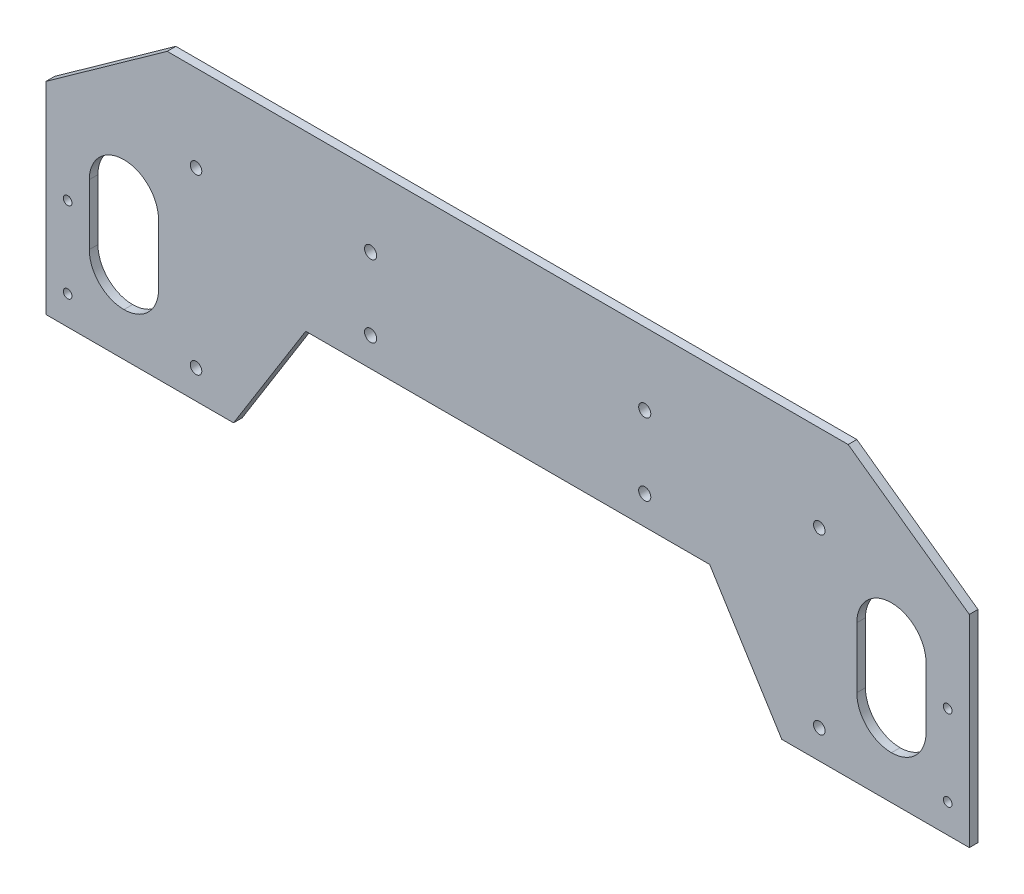
ISO-10303-21;
HEADER;
FILE_DESCRIPTION(('STEP AP214'),'2;1');
FILE_NAME('part.step','',(''),(''),'','','');
FILE_SCHEMA(('AUTOMOTIVE_DESIGN { 1 0 10303 214 1 1 1 1 }'));
ENDSEC;
DATA;
#1=APPLICATION_CONTEXT('core data for automotive mechanical design processes');
#2=APPLICATION_PROTOCOL_DEFINITION('international standard','automotive_design',2000,#1);
#3=PRODUCT_CONTEXT('',#1,'mechanical');
#4=PRODUCT('Part','Part','',(#3));
#5=PRODUCT_RELATED_PRODUCT_CATEGORY('part','',(#4));
#6=PRODUCT_DEFINITION_FORMATION('','',#4);
#7=PRODUCT_DEFINITION_CONTEXT('part definition',#1,'design');
#8=PRODUCT_DEFINITION('design','',#6,#7);
#9=PRODUCT_DEFINITION_SHAPE('','',#8);
#10=(LENGTH_UNIT() NAMED_UNIT(*) SI_UNIT(.MILLI.,.METRE.));
#11=(NAMED_UNIT(*) PLANE_ANGLE_UNIT() SI_UNIT($,.RADIAN.));
#12=(NAMED_UNIT(*) SI_UNIT($,.STERADIAN.) SOLID_ANGLE_UNIT());
#13=UNCERTAINTY_MEASURE_WITH_UNIT(LENGTH_MEASURE(1.E-05),#10,'distance_accuracy_value','');
#14=(GEOMETRIC_REPRESENTATION_CONTEXT(3) GLOBAL_UNCERTAINTY_ASSIGNED_CONTEXT((#13)) GLOBAL_UNIT_ASSIGNED_CONTEXT((#10,
#11,#12)) REPRESENTATION_CONTEXT('',''));
#15=CARTESIAN_POINT('',(0.,0.,0.));
#16=DIRECTION('',(0.,0.,1.));
#17=DIRECTION('',(1.,0.,0.));
#18=AXIS2_PLACEMENT_3D('',#15,#16,#17);
#19=CARTESIAN_POINT('',(0.,0.,0.));
#20=DIRECTION('',(0.,0.,1.));
#21=DIRECTION('',(1.,0.,0.));
#22=AXIS2_PLACEMENT_3D('',#19,#20,#21);
#23=PLANE('',#22);
#24=CARTESIAN_POINT('',(152.5,-40.,0.));
#25=DIRECTION('',(0.,0.,1.));
#26=DIRECTION('',(1.,0.,0.));
#27=AXIS2_PLACEMENT_3D('',#24,#25,#26);
#28=CIRCLE('',#27,1.5);
#29=CARTESIAN_POINT('',(154.,-40.,0.));
#30=VERTEX_POINT('',#29);
#31=EDGE_CURVE('E865',#30,#30,#28,.T.);
#32=ORIENTED_EDGE('',*,*,#31,.T.);
#33=EDGE_LOOP('',(#32));
#34=FACE_BOUND('',#33,.T.);
#35=CARTESIAN_POINT('',(152.5,-12.,0.));
#36=DIRECTION('',(0.,0.,1.));
#37=DIRECTION('',(1.,0.,0.));
#38=AXIS2_PLACEMENT_3D('',#35,#36,#37);
#39=CIRCLE('',#38,1.5);
#40=CARTESIAN_POINT('',(154.,-12.,0.));
#41=VERTEX_POINT('',#40);
#42=EDGE_CURVE('E406',#41,#41,#39,.T.);
#43=ORIENTED_EDGE('',*,*,#42,.T.);
#44=EDGE_LOOP('',(#43));
#45=FACE_BOUND('',#44,.T.);
#46=CARTESIAN_POINT('',(108.,20.,0.));
#47=DIRECTION('',(0.,0.,-1.));
#48=DIRECTION('',(-1.,0.,0.));
#49=AXIS2_PLACEMENT_3D('',#46,#47,#48);
#50=CIRCLE('',#49,1.99999999999999);
#51=CARTESIAN_POINT('',(106.,20.,0.));
#52=VERTEX_POINT('',#51);
#53=EDGE_CURVE('E439',#52,#52,#50,.T.);
#54=ORIENTED_EDGE('',*,*,#53,.F.);
#55=EDGE_LOOP('',(#54));
#56=FACE_BOUND('',#55,.T.);
#57=CARTESIAN_POINT('',(47.5,0.,0.));
#58=DIRECTION('',(0.,0.,-1.));
#59=DIRECTION('',(-1.,0.,0.));
#60=AXIS2_PLACEMENT_3D('',#57,#58,#59);
#61=CIRCLE('',#60,2.1);
#62=CARTESIAN_POINT('',(45.4,0.,0.));
#63=VERTEX_POINT('',#62);
#64=EDGE_CURVE('E357',#63,#63,#61,.T.);
#65=ORIENTED_EDGE('',*,*,#64,.F.);
#66=EDGE_LOOP('',(#65));
#67=FACE_BOUND('',#66,.T.);
#68=CARTESIAN_POINT('',(-47.5,0.,0.));
#69=DIRECTION('',(0.,0.,-1.));
#70=DIRECTION('',(-1.,0.,0.));
#71=AXIS2_PLACEMENT_3D('',#68,#69,#70);
#72=CIRCLE('',#71,2.1);
#73=CARTESIAN_POINT('',(-49.6,0.,0.));
#74=VERTEX_POINT('',#73);
#75=EDGE_CURVE('E360',#74,#74,#72,.T.);
#76=ORIENTED_EDGE('',*,*,#75,.F.);
#77=EDGE_LOOP('',(#76));
#78=FACE_BOUND('',#77,.T.);
#79=CARTESIAN_POINT('',(108.,-40.,0.));
#80=DIRECTION('',(0.,0.,-1.));
#81=DIRECTION('',(-1.,0.,0.));
#82=AXIS2_PLACEMENT_3D('',#79,#80,#81);
#83=CIRCLE('',#82,1.99999999999999);
#84=CARTESIAN_POINT('',(106.,-40.,0.));
#85=VERTEX_POINT('',#84);
#86=EDGE_CURVE('E366',#85,#85,#83,.T.);
#87=ORIENTED_EDGE('',*,*,#86,.F.);
#88=EDGE_LOOP('',(#87));
#89=FACE_BOUND('',#88,.T.);
#90=CARTESIAN_POINT('',(-108.,-40.,0.));
#91=DIRECTION('',(0.,0.,-1.));
#92=DIRECTION('',(-1.,0.,0.));
#93=AXIS2_PLACEMENT_3D('',#90,#91,#92);
#94=CIRCLE('',#93,1.99999999999999);
#95=CARTESIAN_POINT('',(-110.,-40.,0.));
#96=VERTEX_POINT('',#95);
#97=EDGE_CURVE('E214',#96,#96,#94,.T.);
#98=ORIENTED_EDGE('',*,*,#97,.F.);
#99=EDGE_LOOP('',(#98));
#100=FACE_BOUND('',#99,.T.);
#101=CARTESIAN_POINT('',(-47.5,25.,0.));
#102=DIRECTION('',(0.,0.,-1.));
#103=DIRECTION('',(-1.,0.,0.));
#104=AXIS2_PLACEMENT_3D('',#101,#102,#103);
#105=CIRCLE('',#104,2.1);
#106=CARTESIAN_POINT('',(-49.6,25.,0.));
#107=VERTEX_POINT('',#106);
#108=EDGE_CURVE('E233',#107,#107,#105,.T.);
#109=ORIENTED_EDGE('',*,*,#108,.F.);
#110=EDGE_LOOP('',(#109));
#111=FACE_BOUND('',#110,.T.);
#112=CARTESIAN_POINT('',(47.5,25.,0.));
#113=DIRECTION('',(0.,0.,-1.));
#114=DIRECTION('',(-1.,0.,0.));
#115=AXIS2_PLACEMENT_3D('',#112,#113,#114);
#116=CIRCLE('',#115,2.1);
#117=CARTESIAN_POINT('',(45.4,25.,0.));
#118=VERTEX_POINT('',#117);
#119=EDGE_CURVE('E239',#118,#118,#116,.T.);
#120=ORIENTED_EDGE('',*,*,#119,.F.);
#121=EDGE_LOOP('',(#120));
#122=FACE_BOUND('',#121,.T.);
#123=CARTESIAN_POINT('',(133.,-1.99999999999995,0.));
#124=DIRECTION('',(0.,0.,1.));
#125=DIRECTION('',(1.,0.,0.));
#126=AXIS2_PLACEMENT_3D('',#123,#124,#125);
#127=CIRCLE('',#126,12.);
#128=CARTESIAN_POINT('',(145.,-1.99999999999995,0.));
#129=VERTEX_POINT('',#128);
#130=CARTESIAN_POINT('',(133.,10.0000000000001,0.));
#131=VERTEX_POINT('',#130);
#132=EDGE_CURVE('E57',#129,#131,#127,.T.);
#133=ORIENTED_EDGE('',*,*,#132,.T.);
#134=CARTESIAN_POINT('',(133.,-1.99999999999995,0.));
#135=DIRECTION('',(0.,0.,1.));
#136=DIRECTION('',(1.,0.,0.));
#137=AXIS2_PLACEMENT_3D('',#134,#135,#136);
#138=CIRCLE('',#137,12.);
#139=CARTESIAN_POINT('',(121.,-1.99999999999995,0.));
#140=VERTEX_POINT('',#139);
#141=EDGE_CURVE('E43',#131,#140,#138,.T.);
#142=ORIENTED_EDGE('',*,*,#141,.T.);
#143=DIRECTION('',(0.,1.,0.));
#144=VECTOR('',#143,1.);
#145=CARTESIAN_POINT('',(121.,0.,0.));
#146=LINE('',#145,#144);
#147=CARTESIAN_POINT('',(121.,-22.9999999999999,0.));
#148=VERTEX_POINT('',#147);
#149=EDGE_CURVE('E311',#148,#140,#146,.T.);
#150=ORIENTED_EDGE('',*,*,#149,.F.);
#151=CARTESIAN_POINT('',(133.,-22.9999999999999,0.));
#152=DIRECTION('',(0.,0.,1.));
#153=DIRECTION('',(1.,0.,0.));
#154=AXIS2_PLACEMENT_3D('',#151,#152,#153);
#155=CIRCLE('',#154,12.);
#156=CARTESIAN_POINT('',(133.,-35.,0.));
#157=VERTEX_POINT('',#156);
#158=EDGE_CURVE('E282',#148,#157,#155,.T.);
#159=ORIENTED_EDGE('',*,*,#158,.T.);
#160=CARTESIAN_POINT('',(133.,-22.9999999999999,0.));
#161=DIRECTION('',(0.,0.,1.));
#162=DIRECTION('',(1.,0.,0.));
#163=AXIS2_PLACEMENT_3D('',#160,#161,#162);
#164=CIRCLE('',#163,12.);
#165=CARTESIAN_POINT('',(145.,-22.9999999999999,0.));
#166=VERTEX_POINT('',#165);
#167=EDGE_CURVE('E278',#157,#166,#164,.T.);
#168=ORIENTED_EDGE('',*,*,#167,.T.);
#169=DIRECTION('',(0.,-1.,0.));
#170=VECTOR('',#169,1.);
#171=CARTESIAN_POINT('',(145.,0.,0.));
#172=LINE('',#171,#170);
#173=EDGE_CURVE('E318',#129,#166,#172,.T.);
#174=ORIENTED_EDGE('',*,*,#173,.F.);
#175=EDGE_LOOP('',(#133,#142,#150,#159,#168,#174));
#176=FACE_BOUND('',#175,.T.);
#177=DIRECTION('',(0.,1.,0.));
#178=VECTOR('',#177,1.);
#179=CARTESIAN_POINT('',(-121.,0.,0.));
#180=LINE('',#179,#178);
#181=CARTESIAN_POINT('',(-121.,-22.9999999999999,0.));
#182=VERTEX_POINT('',#181);
#183=CARTESIAN_POINT('',(-121.,-1.99999999999995,0.));
#184=VERTEX_POINT('',#183);
#185=EDGE_CURVE('E445',#182,#184,#180,.T.);
#186=ORIENTED_EDGE('',*,*,#185,.T.);
#187=CARTESIAN_POINT('',(-133.,-1.99999999999995,0.));
#188=DIRECTION('',(0.,0.,1.));
#189=DIRECTION('',(1.,0.,0.));
#190=AXIS2_PLACEMENT_3D('',#187,#188,#189);
#191=CIRCLE('',#190,12.);
#192=CARTESIAN_POINT('',(-133.,10.0000000000001,0.));
#193=VERTEX_POINT('',#192);
#194=EDGE_CURVE('E274',#184,#193,#191,.T.);
#195=ORIENTED_EDGE('',*,*,#194,.T.);
#196=CARTESIAN_POINT('',(-133.,-1.99999999999995,0.));
#197=DIRECTION('',(0.,0.,1.));
#198=DIRECTION('',(1.,0.,0.));
#199=AXIS2_PLACEMENT_3D('',#196,#197,#198);
#200=CIRCLE('',#199,12.);
#201=CARTESIAN_POINT('',(-145.,-1.99999999999995,0.));
#202=VERTEX_POINT('',#201);
#203=EDGE_CURVE('E270',#193,#202,#200,.T.);
#204=ORIENTED_EDGE('',*,*,#203,.T.);
#205=DIRECTION('',(0.,-1.,0.));
#206=VECTOR('',#205,1.);
#207=CARTESIAN_POINT('',(-145.,0.,0.));
#208=LINE('',#207,#206);
#209=CARTESIAN_POINT('',(-145.,-22.9999999999999,0.));
#210=VERTEX_POINT('',#209);
#211=EDGE_CURVE('E449',#202,#210,#208,.T.);
#212=ORIENTED_EDGE('',*,*,#211,.T.);
#213=CARTESIAN_POINT('',(-133.,-22.9999999999999,0.));
#214=DIRECTION('',(0.,0.,1.));
#215=DIRECTION('',(1.,0.,0.));
#216=AXIS2_PLACEMENT_3D('',#213,#214,#215);
#217=CIRCLE('',#216,12.);
#218=CARTESIAN_POINT('',(-133.,-35.,0.));
#219=VERTEX_POINT('',#218);
#220=EDGE_CURVE('E262',#210,#219,#217,.T.);
#221=ORIENTED_EDGE('',*,*,#220,.T.);
#222=CARTESIAN_POINT('',(-133.,-22.9999999999999,0.));
#223=DIRECTION('',(0.,0.,1.));
#224=DIRECTION('',(1.,0.,0.));
#225=AXIS2_PLACEMENT_3D('',#222,#223,#224);
#226=CIRCLE('',#225,12.);
#227=EDGE_CURVE('E266',#219,#182,#226,.T.);
#228=ORIENTED_EDGE('',*,*,#227,.T.);
#229=EDGE_LOOP('',(#186,#195,#204,#212,#221,#228));
#230=FACE_BOUND('',#229,.T.);
#231=CARTESIAN_POINT('',(-108.,20.,0.));
#232=DIRECTION('',(0.,0.,-1.));
#233=DIRECTION('',(-1.,0.,0.));
#234=AXIS2_PLACEMENT_3D('',#231,#232,#233);
#235=CIRCLE('',#234,1.99999999999999);
#236=CARTESIAN_POINT('',(-110.,20.,0.));
#237=VERTEX_POINT('',#236);
#238=EDGE_CURVE('E436',#237,#237,#235,.T.);
#239=ORIENTED_EDGE('',*,*,#238,.F.);
#240=EDGE_LOOP('',(#239));
#241=FACE_BOUND('',#240,.T.);
#242=CARTESIAN_POINT('',(-152.5,-12.,0.));
#243=DIRECTION('',(0.,0.,1.));
#244=DIRECTION('',(1.,0.,0.));
#245=AXIS2_PLACEMENT_3D('',#242,#243,#244);
#246=CIRCLE('',#245,1.5);
#247=CARTESIAN_POINT('',(-151.,-12.,0.));
#248=VERTEX_POINT('',#247);
#249=EDGE_CURVE('E430',#248,#248,#246,.T.);
#250=ORIENTED_EDGE('',*,*,#249,.T.);
#251=EDGE_LOOP('',(#250));
#252=FACE_BOUND('',#251,.T.);
#253=CARTESIAN_POINT('',(-152.5,-40.,0.));
#254=DIRECTION('',(0.,0.,1.));
#255=DIRECTION('',(1.,0.,0.));
#256=AXIS2_PLACEMENT_3D('',#253,#254,#255);
#257=CIRCLE('',#256,1.5);
#258=CARTESIAN_POINT('',(-151.,-40.,0.));
#259=VERTEX_POINT('',#258);
#260=EDGE_CURVE('E418',#259,#259,#257,.T.);
#261=ORIENTED_EDGE('',*,*,#260,.T.);
#262=EDGE_LOOP('',(#261));
#263=FACE_BOUND('',#262,.T.);
#264=DIRECTION('',(-0.813733471206735,0.581238193719096,0.));
#265=VECTOR('',#264,1.);
#266=CARTESIAN_POINT('',(63.5135135135135,88.9189189189189,0.));
#267=LINE('',#266,#265);
#268=CARTESIAN_POINT('',(160.,20.,0.));
#269=VERTEX_POINT('',#268);
#270=CARTESIAN_POINT('',(118.,50.,0.));
#271=VERTEX_POINT('',#270);
#272=EDGE_CURVE('E186',#269,#271,#267,.T.);
#273=ORIENTED_EDGE('',*,*,#272,.F.);
#274=DIRECTION('',(0.,1.,0.));
#275=VECTOR('',#274,1.);
#276=CARTESIAN_POINT('',(160.,50.,0.));
#277=LINE('',#276,#275);
#278=CARTESIAN_POINT('',(160.,-50.,0.));
#279=VERTEX_POINT('',#278);
#280=EDGE_CURVE('E201',#279,#269,#277,.T.);
#281=ORIENTED_EDGE('',*,*,#280,.F.);
#282=DIRECTION('',(1.,0.,0.));
#283=VECTOR('',#282,1.);
#284=CARTESIAN_POINT('',(-160.,-50.,0.));
#285=LINE('',#284,#283);
#286=CARTESIAN_POINT('',(94.9999999999989,-50.,0.));
#287=VERTEX_POINT('',#286);
#288=EDGE_CURVE('E221',#287,#279,#285,.T.);
#289=ORIENTED_EDGE('',*,*,#288,.F.);
#290=DIRECTION('',(-0.529998940003163,0.847998304005099,0.));
#291=VECTOR('',#290,1.);
#292=CARTESIAN_POINT('',(70.,-9.99999999999997,0.));
#293=LINE('',#292,#291);
#294=CARTESIAN_POINT('',(70.,-9.99999999999997,0.));
#295=VERTEX_POINT('',#294);
#296=EDGE_CURVE('E332',#287,#295,#293,.T.);
#297=ORIENTED_EDGE('',*,*,#296,.T.);
#298=DIRECTION('',(1.,0.,0.));
#299=VECTOR('',#298,1.);
#300=CARTESIAN_POINT('',(0.,-9.99999999999997,0.));
#301=LINE('',#300,#299);
#302=CARTESIAN_POINT('',(-70.,-9.99999999999997,0.));
#303=VERTEX_POINT('',#302);
#304=EDGE_CURVE('E345',#303,#295,#301,.T.);
#305=ORIENTED_EDGE('',*,*,#304,.F.);
#306=DIRECTION('',(0.529998940003163,0.847998304005099,0.));
#307=VECTOR('',#306,1.);
#308=CARTESIAN_POINT('',(-70.,-9.99999999999997,0.));
#309=LINE('',#308,#307);
#310=CARTESIAN_POINT('',(-94.9999999999989,-50.,0.));
#311=VERTEX_POINT('',#310);
#312=EDGE_CURVE('E338',#311,#303,#309,.T.);
#313=ORIENTED_EDGE('',*,*,#312,.F.);
#314=CARTESIAN_POINT('',(-160.,-50.,0.));
#315=VERTEX_POINT('',#314);
#316=EDGE_CURVE('E222',#315,#311,#285,.T.);
#317=ORIENTED_EDGE('',*,*,#316,.F.);
#318=DIRECTION('',(0.,-1.,0.));
#319=VECTOR('',#318,1.);
#320=CARTESIAN_POINT('',(-160.,50.,0.));
#321=LINE('',#320,#319);
#322=CARTESIAN_POINT('',(-160.,20.,0.));
#323=VERTEX_POINT('',#322);
#324=EDGE_CURVE('E211',#323,#315,#321,.T.);
#325=ORIENTED_EDGE('',*,*,#324,.F.);
#326=DIRECTION('',(0.813733471206735,0.581238193719096,0.));
#327=VECTOR('',#326,1.);
#328=CARTESIAN_POINT('',(-63.5135135135135,88.9189189189189,0.));
#329=LINE('',#328,#327);
#330=CARTESIAN_POINT('',(-118.,50.,0.));
#331=VERTEX_POINT('',#330);
#332=EDGE_CURVE('E420',#323,#331,#329,.T.);
#333=ORIENTED_EDGE('',*,*,#332,.T.);
#334=DIRECTION('',(-1.,0.,0.));
#335=VECTOR('',#334,1.);
#336=CARTESIAN_POINT('',(-160.,50.,0.));
#337=LINE('',#336,#335);
#338=EDGE_CURVE('E203',#271,#331,#337,.T.);
#339=ORIENTED_EDGE('',*,*,#338,.F.);
#340=EDGE_LOOP('',(#273,#281,#289,#297,#305,#313,#317,#325,#333,#339));
#341=FACE_BOUND('',#340,.T.);
#342=ADVANCED_FACE('F34',(#34,#45,#56,#67,#78,#89,#100,#111,#122,#176,#230,#241,#252,#263,#341),
#23,.F.);
#343=CARTESIAN_POINT('',(0.,0.,3.));
#344=DIRECTION('',(0.,0.,1.));
#345=DIRECTION('',(1.,0.,0.));
#346=AXIS2_PLACEMENT_3D('',#343,#344,#345);
#347=PLANE('',#346);
#348=CARTESIAN_POINT('',(152.5,-40.,3.));
#349=DIRECTION('',(0.,0.,1.));
#350=DIRECTION('',(1.,0.,0.));
#351=AXIS2_PLACEMENT_3D('',#348,#349,#350);
#352=CIRCLE('',#351,1.5);
#353=CARTESIAN_POINT('',(154.,-40.,3.));
#354=VERTEX_POINT('',#353);
#355=EDGE_CURVE('E293',#354,#354,#352,.T.);
#356=ORIENTED_EDGE('',*,*,#355,.F.);
#357=EDGE_LOOP('',(#356));
#358=FACE_BOUND('',#357,.T.);
#359=CARTESIAN_POINT('',(152.5,-12.,3.));
#360=DIRECTION('',(0.,0.,1.));
#361=DIRECTION('',(1.,0.,0.));
#362=AXIS2_PLACEMENT_3D('',#359,#360,#361);
#363=CIRCLE('',#362,1.5);
#364=CARTESIAN_POINT('',(154.,-12.,3.));
#365=VERTEX_POINT('',#364);
#366=EDGE_CURVE('E863',#365,#365,#363,.T.);
#367=ORIENTED_EDGE('',*,*,#366,.F.);
#368=EDGE_LOOP('',(#367));
#369=FACE_BOUND('',#368,.T.);
#370=CARTESIAN_POINT('',(-133.,-1.99999999999995,3.));
#371=DIRECTION('',(0.,0.,1.));
#372=DIRECTION('',(1.,0.,0.));
#373=AXIS2_PLACEMENT_3D('',#370,#371,#372);
#374=CIRCLE('',#373,12.);
#375=CARTESIAN_POINT('',(-145.,-1.99999999999995,3.));
#376=VERTEX_POINT('',#375);
#377=CARTESIAN_POINT('',(-133.,10.0000000000001,3.));
#378=VERTEX_POINT('',#377);
#379=EDGE_CURVE('E272',#376,#378,#374,.F.);
#380=ORIENTED_EDGE('',*,*,#379,.T.);
#381=CARTESIAN_POINT('',(-133.,-1.99999999999995,3.));
#382=DIRECTION('',(0.,0.,1.));
#383=DIRECTION('',(1.,0.,0.));
#384=AXIS2_PLACEMENT_3D('',#381,#382,#383);
#385=CIRCLE('',#384,12.);
#386=CARTESIAN_POINT('',(-121.,-1.99999999999995,3.));
#387=VERTEX_POINT('',#386);
#388=EDGE_CURVE('E276',#378,#387,#385,.F.);
#389=ORIENTED_EDGE('',*,*,#388,.T.);
#390=DIRECTION('',(0.,1.,0.));
#391=VECTOR('',#390,1.);
#392=CARTESIAN_POINT('',(-121.,0.,3.));
#393=LINE('',#392,#391);
#394=CARTESIAN_POINT('',(-121.,-22.9999999999999,3.));
#395=VERTEX_POINT('',#394);
#396=EDGE_CURVE('E446',#395,#387,#393,.T.);
#397=ORIENTED_EDGE('',*,*,#396,.F.);
#398=CARTESIAN_POINT('',(-133.,-22.9999999999999,3.));
#399=DIRECTION('',(0.,0.,1.));
#400=DIRECTION('',(1.,0.,0.));
#401=AXIS2_PLACEMENT_3D('',#398,#399,#400);
#402=CIRCLE('',#401,12.);
#403=CARTESIAN_POINT('',(-133.,-35.,3.));
#404=VERTEX_POINT('',#403);
#405=EDGE_CURVE('E268',#395,#404,#402,.F.);
#406=ORIENTED_EDGE('',*,*,#405,.T.);
#407=CARTESIAN_POINT('',(-133.,-22.9999999999999,3.));
#408=DIRECTION('',(0.,0.,1.));
#409=DIRECTION('',(1.,0.,0.));
#410=AXIS2_PLACEMENT_3D('',#407,#408,#409);
#411=CIRCLE('',#410,12.);
#412=CARTESIAN_POINT('',(-145.,-22.9999999999999,3.));
#413=VERTEX_POINT('',#412);
#414=EDGE_CURVE('E264',#404,#413,#411,.F.);
#415=ORIENTED_EDGE('',*,*,#414,.T.);
#416=DIRECTION('',(0.,-1.,0.));
#417=VECTOR('',#416,1.);
#418=CARTESIAN_POINT('',(-145.,0.,3.));
#419=LINE('',#418,#417);
#420=EDGE_CURVE('E324',#376,#413,#419,.T.);
#421=ORIENTED_EDGE('',*,*,#420,.F.);
#422=EDGE_LOOP('',(#380,#389,#397,#406,#415,#421));
#423=FACE_BOUND('',#422,.T.);
#424=DIRECTION('',(0.,1.,0.));
#425=VECTOR('',#424,1.);
#426=CARTESIAN_POINT('',(121.,0.,3.));
#427=LINE('',#426,#425);
#428=CARTESIAN_POINT('',(121.,-22.9999999999999,3.));
#429=VERTEX_POINT('',#428);
#430=CARTESIAN_POINT('',(121.,-1.99999999999995,3.));
#431=VERTEX_POINT('',#430);
#432=EDGE_CURVE('E321',#429,#431,#427,.T.);
#433=ORIENTED_EDGE('',*,*,#432,.T.);
#434=CARTESIAN_POINT('',(133.,-1.99999999999995,3.));
#435=DIRECTION('',(0.,0.,1.));
#436=DIRECTION('',(1.,0.,0.));
#437=AXIS2_PLACEMENT_3D('',#434,#435,#436);
#438=CIRCLE('',#437,12.);
#439=CARTESIAN_POINT('',(133.,10.0000000000001,3.));
#440=VERTEX_POINT('',#439);
#441=EDGE_CURVE('E11',#431,#440,#438,.F.);
#442=ORIENTED_EDGE('',*,*,#441,.T.);
#443=CARTESIAN_POINT('',(133.,-1.99999999999995,3.));
#444=DIRECTION('',(0.,0.,1.));
#445=DIRECTION('',(1.,0.,0.));
#446=AXIS2_PLACEMENT_3D('',#443,#444,#445);
#447=CIRCLE('',#446,12.);
#448=CARTESIAN_POINT('',(145.,-1.99999999999995,3.));
#449=VERTEX_POINT('',#448);
#450=EDGE_CURVE('E287',#440,#449,#447,.F.);
#451=ORIENTED_EDGE('',*,*,#450,.T.);
#452=DIRECTION('',(0.,-1.,0.));
#453=VECTOR('',#452,1.);
#454=CARTESIAN_POINT('',(145.,0.,3.));
#455=LINE('',#454,#453);
#456=CARTESIAN_POINT('',(145.,-22.9999999999999,3.));
#457=VERTEX_POINT('',#456);
#458=EDGE_CURVE('E317',#449,#457,#455,.T.);
#459=ORIENTED_EDGE('',*,*,#458,.T.);
#460=CARTESIAN_POINT('',(133.,-22.9999999999999,3.));
#461=DIRECTION('',(0.,0.,1.));
#462=DIRECTION('',(1.,0.,0.));
#463=AXIS2_PLACEMENT_3D('',#460,#461,#462);
#464=CIRCLE('',#463,12.);
#465=CARTESIAN_POINT('',(133.,-35.,3.));
#466=VERTEX_POINT('',#465);
#467=EDGE_CURVE('E280',#457,#466,#464,.F.);
#468=ORIENTED_EDGE('',*,*,#467,.T.);
#469=CARTESIAN_POINT('',(133.,-22.9999999999999,3.));
#470=DIRECTION('',(0.,0.,1.));
#471=DIRECTION('',(1.,0.,0.));
#472=AXIS2_PLACEMENT_3D('',#469,#470,#471);
#473=CIRCLE('',#472,12.);
#474=EDGE_CURVE('E284',#466,#429,#473,.F.);
#475=ORIENTED_EDGE('',*,*,#474,.T.);
#476=EDGE_LOOP('',(#433,#442,#451,#459,#468,#475));
#477=FACE_BOUND('',#476,.T.);
#478=CARTESIAN_POINT('',(47.5,25.,3.));
#479=DIRECTION('',(0.,0.,-1.));
#480=DIRECTION('',(-1.,0.,0.));
#481=AXIS2_PLACEMENT_3D('',#478,#479,#480);
#482=CIRCLE('',#481,2.1);
#483=CARTESIAN_POINT('',(45.4,25.,3.));
#484=VERTEX_POINT('',#483);
#485=EDGE_CURVE('E236',#484,#484,#482,.T.);
#486=ORIENTED_EDGE('',*,*,#485,.T.);
#487=EDGE_LOOP('',(#486));
#488=FACE_BOUND('',#487,.T.);
#489=CARTESIAN_POINT('',(-47.5,25.,3.));
#490=DIRECTION('',(0.,0.,-1.));
#491=DIRECTION('',(-1.,0.,0.));
#492=AXIS2_PLACEMENT_3D('',#489,#490,#491);
#493=CIRCLE('',#492,2.1);
#494=CARTESIAN_POINT('',(-49.6,25.,3.));
#495=VERTEX_POINT('',#494);
#496=EDGE_CURVE('E230',#495,#495,#493,.T.);
#497=ORIENTED_EDGE('',*,*,#496,.T.);
#498=EDGE_LOOP('',(#497));
#499=FACE_BOUND('',#498,.T.);
#500=CARTESIAN_POINT('',(-108.,-40.,3.));
#501=DIRECTION('',(0.,0.,-1.));
#502=DIRECTION('',(-1.,0.,0.));
#503=AXIS2_PLACEMENT_3D('',#500,#501,#502);
#504=CIRCLE('',#503,2.);
#505=CARTESIAN_POINT('',(-110.,-40.,3.));
#506=VERTEX_POINT('',#505);
#507=EDGE_CURVE('E209',#506,#506,#504,.T.);
#508=ORIENTED_EDGE('',*,*,#507,.T.);
#509=EDGE_LOOP('',(#508));
#510=FACE_BOUND('',#509,.T.);
#511=CARTESIAN_POINT('',(108.,-40.,3.));
#512=DIRECTION('',(0.,0.,-1.));
#513=DIRECTION('',(-1.,0.,0.));
#514=AXIS2_PLACEMENT_3D('',#511,#512,#513);
#515=CIRCLE('',#514,2.);
#516=CARTESIAN_POINT('',(106.,-40.,3.));
#517=VERTEX_POINT('',#516);
#518=EDGE_CURVE('E369',#517,#517,#515,.T.);
#519=ORIENTED_EDGE('',*,*,#518,.T.);
#520=EDGE_LOOP('',(#519));
#521=FACE_BOUND('',#520,.T.);
#522=CARTESIAN_POINT('',(-47.5,0.,3.));
#523=DIRECTION('',(0.,0.,-1.));
#524=DIRECTION('',(-1.,0.,0.));
#525=AXIS2_PLACEMENT_3D('',#522,#523,#524);
#526=CIRCLE('',#525,2.1);
#527=CARTESIAN_POINT('',(-49.6,0.,3.));
#528=VERTEX_POINT('',#527);
#529=EDGE_CURVE('E363',#528,#528,#526,.T.);
#530=ORIENTED_EDGE('',*,*,#529,.T.);
#531=EDGE_LOOP('',(#530));
#532=FACE_BOUND('',#531,.T.);
#533=CARTESIAN_POINT('',(47.5,0.,3.));
#534=DIRECTION('',(0.,0.,-1.));
#535=DIRECTION('',(-1.,0.,0.));
#536=AXIS2_PLACEMENT_3D('',#533,#534,#535);
#537=CIRCLE('',#536,2.1);
#538=CARTESIAN_POINT('',(45.4,0.,3.));
#539=VERTEX_POINT('',#538);
#540=EDGE_CURVE('E353',#539,#539,#537,.T.);
#541=ORIENTED_EDGE('',*,*,#540,.T.);
#542=EDGE_LOOP('',(#541));
#543=FACE_BOUND('',#542,.T.);
#544=CARTESIAN_POINT('',(108.,20.,3.));
#545=DIRECTION('',(0.,0.,-1.));
#546=DIRECTION('',(-1.,0.,0.));
#547=AXIS2_PLACEMENT_3D('',#544,#545,#546);
#548=CIRCLE('',#547,2.);
#549=CARTESIAN_POINT('',(106.,20.,3.));
#550=VERTEX_POINT('',#549);
#551=EDGE_CURVE('E442',#550,#550,#548,.T.);
#552=ORIENTED_EDGE('',*,*,#551,.T.);
#553=EDGE_LOOP('',(#552));
#554=FACE_BOUND('',#553,.T.);
#555=CARTESIAN_POINT('',(-108.,20.,3.));
#556=DIRECTION('',(0.,0.,-1.));
#557=DIRECTION('',(-1.,0.,0.));
#558=AXIS2_PLACEMENT_3D('',#555,#556,#557);
#559=CIRCLE('',#558,2.);
#560=CARTESIAN_POINT('',(-110.,20.,3.));
#561=VERTEX_POINT('',#560);
#562=EDGE_CURVE('E433',#561,#561,#559,.T.);
#563=ORIENTED_EDGE('',*,*,#562,.T.);
#564=EDGE_LOOP('',(#563));
#565=FACE_BOUND('',#564,.T.);
#566=CARTESIAN_POINT('',(-152.5,-12.,3.));
#567=DIRECTION('',(0.,0.,1.));
#568=DIRECTION('',(1.,0.,0.));
#569=AXIS2_PLACEMENT_3D('',#566,#567,#568);
#570=CIRCLE('',#569,1.5);
#571=CARTESIAN_POINT('',(-151.,-12.,3.));
#572=VERTEX_POINT('',#571);
#573=EDGE_CURVE('E427',#572,#572,#570,.T.);
#574=ORIENTED_EDGE('',*,*,#573,.F.);
#575=EDGE_LOOP('',(#574));
#576=FACE_BOUND('',#575,.T.);
#577=CARTESIAN_POINT('',(-152.5,-40.,3.));
#578=DIRECTION('',(0.,0.,1.));
#579=DIRECTION('',(1.,0.,0.));
#580=AXIS2_PLACEMENT_3D('',#577,#578,#579);
#581=CIRCLE('',#580,1.5);
#582=CARTESIAN_POINT('',(-151.,-40.,3.));
#583=VERTEX_POINT('',#582);
#584=EDGE_CURVE('E414',#583,#583,#581,.T.);
#585=ORIENTED_EDGE('',*,*,#584,.F.);
#586=EDGE_LOOP('',(#585));
#587=FACE_BOUND('',#586,.T.);
#588=DIRECTION('',(0.,1.,0.));
#589=VECTOR('',#588,1.);
#590=CARTESIAN_POINT('',(160.,50.,3.));
#591=LINE('',#590,#589);
#592=CARTESIAN_POINT('',(160.,-50.,3.));
#593=VERTEX_POINT('',#592);
#594=CARTESIAN_POINT('',(160.,20.,3.));
#595=VERTEX_POINT('',#594);
#596=EDGE_CURVE('E225',#593,#595,#591,.T.);
#597=ORIENTED_EDGE('',*,*,#596,.T.);
#598=DIRECTION('',(-0.813733471206735,0.581238193719096,0.));
#599=VECTOR('',#598,1.);
#600=CARTESIAN_POINT('',(63.5135135135135,88.9189189189189,3.));
#601=LINE('',#600,#599);
#602=CARTESIAN_POINT('',(118.,50.,3.));
#603=VERTEX_POINT('',#602);
#604=EDGE_CURVE('E189',#595,#603,#601,.T.);
#605=ORIENTED_EDGE('',*,*,#604,.T.);
#606=DIRECTION('',(-1.,0.,0.));
#607=VECTOR('',#606,1.);
#608=CARTESIAN_POINT('',(-160.,50.,3.));
#609=LINE('',#608,#607);
#610=CARTESIAN_POINT('',(-118.,50.,3.));
#611=VERTEX_POINT('',#610);
#612=EDGE_CURVE('E375',#603,#611,#609,.T.);
#613=ORIENTED_EDGE('',*,*,#612,.T.);
#614=DIRECTION('',(0.813733471206735,0.581238193719096,0.));
#615=VECTOR('',#614,1.);
#616=CARTESIAN_POINT('',(-63.5135135135135,88.9189189189189,3.));
#617=LINE('',#616,#615);
#618=CARTESIAN_POINT('',(-160.,20.,3.));
#619=VERTEX_POINT('',#618);
#620=EDGE_CURVE('E194',#619,#611,#617,.T.);
#621=ORIENTED_EDGE('',*,*,#620,.F.);
#622=DIRECTION('',(0.,-1.,0.));
#623=VECTOR('',#622,1.);
#624=CARTESIAN_POINT('',(-160.,50.,3.));
#625=LINE('',#624,#623);
#626=CARTESIAN_POINT('',(-160.,-50.,3.));
#627=VERTEX_POINT('',#626);
#628=EDGE_CURVE('E376',#619,#627,#625,.T.);
#629=ORIENTED_EDGE('',*,*,#628,.T.);
#630=DIRECTION('',(1.,0.,0.));
#631=VECTOR('',#630,1.);
#632=CARTESIAN_POINT('',(-160.,-50.,3.));
#633=LINE('',#632,#631);
#634=CARTESIAN_POINT('',(-94.9999999999989,-50.,3.));
#635=VERTEX_POINT('',#634);
#636=EDGE_CURVE('E217',#627,#635,#633,.T.);
#637=ORIENTED_EDGE('',*,*,#636,.T.);
#638=DIRECTION('',(0.529998940003163,0.847998304005099,0.));
#639=VECTOR('',#638,1.);
#640=CARTESIAN_POINT('',(-70.,-9.99999999999997,3.));
#641=LINE('',#640,#639);
#642=CARTESIAN_POINT('',(-70.,-9.99999999999997,3.));
#643=VERTEX_POINT('',#642);
#644=EDGE_CURVE('E341',#635,#643,#641,.T.);
#645=ORIENTED_EDGE('',*,*,#644,.T.);
#646=DIRECTION('',(1.,0.,0.));
#647=VECTOR('',#646,1.);
#648=CARTESIAN_POINT('',(0.,-9.99999999999997,3.));
#649=LINE('',#648,#647);
#650=CARTESIAN_POINT('',(70.,-9.99999999999997,3.));
#651=VERTEX_POINT('',#650);
#652=EDGE_CURVE('E344',#643,#651,#649,.T.);
#653=ORIENTED_EDGE('',*,*,#652,.T.);
#654=DIRECTION('',(-0.529998940003163,0.847998304005099,0.));
#655=VECTOR('',#654,1.);
#656=CARTESIAN_POINT('',(70.,-9.99999999999997,3.));
#657=LINE('',#656,#655);
#658=CARTESIAN_POINT('',(94.9999999999989,-50.,3.));
#659=VERTEX_POINT('',#658);
#660=EDGE_CURVE('E328',#659,#651,#657,.T.);
#661=ORIENTED_EDGE('',*,*,#660,.F.);
#662=EDGE_CURVE('E377',#659,#593,#633,.T.);
#663=ORIENTED_EDGE('',*,*,#662,.T.);
#664=EDGE_LOOP('',(#597,#605,#613,#621,#629,#637,#645,#653,#661,#663));
#665=FACE_BOUND('',#664,.T.);
#666=ADVANCED_FACE('F386',(#358,#369,#423,#477,#488,#499,#510,#521,#532,#543,#554,#565,#576,
#587,#665),#347,.T.);
#667=CARTESIAN_POINT('',(160.,50.,3.));
#668=DIRECTION('',(-1.,0.,0.));
#669=DIRECTION('',(0.,0.,1.));
#670=AXIS2_PLACEMENT_3D('',#667,#668,#669);
#671=PLANE('',#670);
#672=DIRECTION('',(0.,0.,1.));
#673=VECTOR('',#672,1.);
#674=CARTESIAN_POINT('',(160.,20.,0.));
#675=LINE('',#674,#673);
#676=EDGE_CURVE('E183',#269,#595,#675,.T.);
#677=ORIENTED_EDGE('',*,*,#676,.T.);
#678=ORIENTED_EDGE('',*,*,#596,.F.);
#679=DIRECTION('',(0.,0.,-1.));
#680=VECTOR('',#679,1.);
#681=CARTESIAN_POINT('',(160.,-50.,3.));
#682=LINE('',#681,#680);
#683=EDGE_CURVE('E208',#593,#279,#682,.T.);
#684=ORIENTED_EDGE('',*,*,#683,.T.);
#685=ORIENTED_EDGE('',*,*,#280,.T.);
#686=EDGE_LOOP('',(#677,#678,#684,#685));
#687=FACE_BOUND('',#686,.T.);
#688=ADVANCED_FACE('F206',(#687),#671,.F.);
#689=CARTESIAN_POINT('',(-160.,50.,3.));
#690=DIRECTION('',(0.,-1.,0.));
#691=DIRECTION('',(0.,0.,-1.));
#692=AXIS2_PLACEMENT_3D('',#689,#690,#691);
#693=PLANE('',#692);
#694=DIRECTION('',(0.,0.,1.));
#695=VECTOR('',#694,1.);
#696=CARTESIAN_POINT('',(118.,50.,0.));
#697=LINE('',#696,#695);
#698=EDGE_CURVE('E195',#271,#603,#697,.T.);
#699=ORIENTED_EDGE('',*,*,#698,.F.);
#700=ORIENTED_EDGE('',*,*,#338,.T.);
#701=DIRECTION('',(0.,0.,1.));
#702=VECTOR('',#701,1.);
#703=CARTESIAN_POINT('',(-118.,50.,0.));
#704=LINE('',#703,#702);
#705=EDGE_CURVE('E412',#331,#611,#704,.T.);
#706=ORIENTED_EDGE('',*,*,#705,.T.);
#707=ORIENTED_EDGE('',*,*,#612,.F.);
#708=EDGE_LOOP('',(#699,#700,#706,#707));
#709=FACE_BOUND('',#708,.T.);
#710=ADVANCED_FACE('F410',(#709),#693,.F.);
#711=CARTESIAN_POINT('',(-160.,-50.,3.));
#712=DIRECTION('',(0.,1.,0.));
#713=DIRECTION('',(0.,0.,1.));
#714=AXIS2_PLACEMENT_3D('',#711,#712,#713);
#715=PLANE('',#714);
#716=DIRECTION('',(0.,0.,-1.));
#717=VECTOR('',#716,1.);
#718=CARTESIAN_POINT('',(94.9999999999989,-50.,3.));
#719=LINE('',#718,#717);
#720=EDGE_CURVE('E335',#659,#287,#719,.T.);
#721=ORIENTED_EDGE('',*,*,#720,.T.);
#722=ORIENTED_EDGE('',*,*,#288,.T.);
#723=ORIENTED_EDGE('',*,*,#683,.F.);
#724=ORIENTED_EDGE('',*,*,#662,.F.);
#725=EDGE_LOOP('',(#721,#722,#723,#724));
#726=FACE_BOUND('',#725,.T.);
#727=ADVANCED_FACE('F403',(#726),#715,.F.);
#728=CARTESIAN_POINT('',(-160.,50.,3.));
#729=DIRECTION('',(1.,0.,0.));
#730=DIRECTION('',(0.,0.,-1.));
#731=AXIS2_PLACEMENT_3D('',#728,#729,#730);
#732=PLANE('',#731);
#733=ORIENTED_EDGE('',*,*,#628,.F.);
#734=DIRECTION('',(0.,0.,1.));
#735=VECTOR('',#734,1.);
#736=CARTESIAN_POINT('',(-160.,20.,0.));
#737=LINE('',#736,#735);
#738=EDGE_CURVE('E415',#323,#619,#737,.T.);
#739=ORIENTED_EDGE('',*,*,#738,.F.);
#740=ORIENTED_EDGE('',*,*,#324,.T.);
#741=DIRECTION('',(0.,0.,-1.));
#742=VECTOR('',#741,1.);
#743=CARTESIAN_POINT('',(-160.,-50.,3.));
#744=LINE('',#743,#742);
#745=EDGE_CURVE('E227',#627,#315,#744,.T.);
#746=ORIENTED_EDGE('',*,*,#745,.F.);
#747=EDGE_LOOP('',(#733,#739,#740,#746));
#748=FACE_BOUND('',#747,.T.);
#749=ADVANCED_FACE('F488',(#748),#732,.F.);
#750=ORIENTED_EDGE('',*,*,#316,.T.);
#751=DIRECTION('',(0.,0.,-1.));
#752=VECTOR('',#751,1.);
#753=CARTESIAN_POINT('',(-94.9999999999989,-50.,3.));
#754=LINE('',#753,#752);
#755=EDGE_CURVE('E347',#635,#311,#754,.T.);
#756=ORIENTED_EDGE('',*,*,#755,.F.);
#757=ORIENTED_EDGE('',*,*,#636,.F.);
#758=ORIENTED_EDGE('',*,*,#745,.T.);
#759=EDGE_LOOP('',(#750,#756,#757,#758));
#760=FACE_BOUND('',#759,.T.);
#761=ADVANCED_FACE('F389',(#760),#715,.F.);
#762=CARTESIAN_POINT('',(-108.,-40.,0.));
#763=DIRECTION('',(0.,0.,-1.));
#764=DIRECTION('',(-1.,0.,0.));
#765=AXIS2_PLACEMENT_3D('',#762,#763,#764);
#766=CYLINDRICAL_SURFACE('',#765,1.99999999999999);
#767=ORIENTED_EDGE('',*,*,#507,.F.);
#768=EDGE_LOOP('',(#767));
#769=FACE_BOUND('',#768,.T.);
#770=ORIENTED_EDGE('',*,*,#97,.T.);
#771=EDGE_LOOP('',(#770));
#772=FACE_BOUND('',#771,.T.);
#773=ADVANCED_FACE('F487',(#769,#772),#766,.F.);
#774=CARTESIAN_POINT('',(108.,-40.,0.));
#775=DIRECTION('',(0.,0.,-1.));
#776=DIRECTION('',(-1.,0.,0.));
#777=AXIS2_PLACEMENT_3D('',#774,#775,#776);
#778=CYLINDRICAL_SURFACE('',#777,1.99999999999999);
#779=ORIENTED_EDGE('',*,*,#518,.F.);
#780=EDGE_LOOP('',(#779));
#781=FACE_BOUND('',#780,.T.);
#782=ORIENTED_EDGE('',*,*,#86,.T.);
#783=EDGE_LOOP('',(#782));
#784=FACE_BOUND('',#783,.T.);
#785=ADVANCED_FACE('F569',(#781,#784),#778,.F.);
#786=CARTESIAN_POINT('',(-47.5,0.,0.));
#787=DIRECTION('',(0.,0.,-1.));
#788=DIRECTION('',(-1.,0.,0.));
#789=AXIS2_PLACEMENT_3D('',#786,#787,#788);
#790=CYLINDRICAL_SURFACE('',#789,2.1);
#791=ORIENTED_EDGE('',*,*,#529,.F.);
#792=EDGE_LOOP('',(#791));
#793=FACE_BOUND('',#792,.T.);
#794=ORIENTED_EDGE('',*,*,#75,.T.);
#795=EDGE_LOOP('',(#794));
#796=FACE_BOUND('',#795,.T.);
#797=ADVANCED_FACE('F565',(#793,#796),#790,.F.);
#798=CARTESIAN_POINT('',(47.5,0.,0.));
#799=DIRECTION('',(0.,0.,-1.));
#800=DIRECTION('',(-1.,0.,0.));
#801=AXIS2_PLACEMENT_3D('',#798,#799,#800);
#802=CYLINDRICAL_SURFACE('',#801,2.1);
#803=ORIENTED_EDGE('',*,*,#540,.F.);
#804=EDGE_LOOP('',(#803));
#805=FACE_BOUND('',#804,.T.);
#806=ORIENTED_EDGE('',*,*,#64,.T.);
#807=EDGE_LOOP('',(#806));
#808=FACE_BOUND('',#807,.T.);
#809=ADVANCED_FACE('F500',(#805,#808),#802,.F.);
#810=CARTESIAN_POINT('',(-47.5,25.,0.));
#811=DIRECTION('',(0.,0.,-1.));
#812=DIRECTION('',(-1.,0.,0.));
#813=AXIS2_PLACEMENT_3D('',#810,#811,#812);
#814=CYLINDRICAL_SURFACE('',#813,2.1);
#815=ORIENTED_EDGE('',*,*,#496,.F.);
#816=EDGE_LOOP('',(#815));
#817=FACE_BOUND('',#816,.T.);
#818=ORIENTED_EDGE('',*,*,#108,.T.);
#819=EDGE_LOOP('',(#818));
#820=FACE_BOUND('',#819,.T.);
#821=ADVANCED_FACE('F496',(#817,#820),#814,.F.);
#822=CARTESIAN_POINT('',(47.5,25.,0.));
#823=DIRECTION('',(0.,0.,-1.));
#824=DIRECTION('',(-1.,0.,0.));
#825=AXIS2_PLACEMENT_3D('',#822,#823,#824);
#826=CYLINDRICAL_SURFACE('',#825,2.1);
#827=ORIENTED_EDGE('',*,*,#485,.F.);
#828=EDGE_LOOP('',(#827));
#829=FACE_BOUND('',#828,.T.);
#830=ORIENTED_EDGE('',*,*,#119,.T.);
#831=EDGE_LOOP('',(#830));
#832=FACE_BOUND('',#831,.T.);
#833=ADVANCED_FACE('F499',(#829,#832),#826,.F.);
#834=CARTESIAN_POINT('',(0.,-9.99999999999997,3.));
#835=DIRECTION('',(0.,1.,0.));
#836=DIRECTION('',(0.,0.,1.));
#837=AXIS2_PLACEMENT_3D('',#834,#835,#836);
#838=PLANE('',#837);
#839=ORIENTED_EDGE('',*,*,#304,.T.);
#840=DIRECTION('',(0.,0.,-1.));
#841=VECTOR('',#840,1.);
#842=CARTESIAN_POINT('',(70.,-9.99999999999997,3.));
#843=LINE('',#842,#841);
#844=EDGE_CURVE('E331',#651,#295,#843,.T.);
#845=ORIENTED_EDGE('',*,*,#844,.F.);
#846=ORIENTED_EDGE('',*,*,#652,.F.);
#847=DIRECTION('',(0.,0.,-1.));
#848=VECTOR('',#847,1.);
#849=CARTESIAN_POINT('',(-70.,-9.99999999999997,3.));
#850=LINE('',#849,#848);
#851=EDGE_CURVE('E351',#643,#303,#850,.T.);
#852=ORIENTED_EDGE('',*,*,#851,.T.);
#853=EDGE_LOOP('',(#839,#845,#846,#852));
#854=FACE_BOUND('',#853,.T.);
#855=ADVANCED_FACE('F398',(#854),#838,.F.);
#856=CARTESIAN_POINT('',(-70.,-9.99999999999997,3.));
#857=DIRECTION('',(-0.847998304005099,0.529998940003163,0.));
#858=DIRECTION('',(-0.529998940003163,-0.847998304005099,0.));
#859=AXIS2_PLACEMENT_3D('',#856,#857,#858);
#860=PLANE('',#859);
#861=ORIENTED_EDGE('',*,*,#312,.T.);
#862=ORIENTED_EDGE('',*,*,#851,.F.);
#863=ORIENTED_EDGE('',*,*,#644,.F.);
#864=ORIENTED_EDGE('',*,*,#755,.T.);
#865=EDGE_LOOP('',(#861,#862,#863,#864));
#866=FACE_BOUND('',#865,.T.);
#867=ADVANCED_FACE('F393',(#866),#860,.F.);
#868=CARTESIAN_POINT('',(70.,-9.99999999999997,3.));
#869=DIRECTION('',(-0.847998304005099,-0.529998940003163,0.));
#870=DIRECTION('',(0.529998940003163,-0.847998304005099,0.));
#871=AXIS2_PLACEMENT_3D('',#868,#869,#870);
#872=PLANE('',#871);
#873=ORIENTED_EDGE('',*,*,#296,.F.);
#874=ORIENTED_EDGE('',*,*,#720,.F.);
#875=ORIENTED_EDGE('',*,*,#660,.T.);
#876=ORIENTED_EDGE('',*,*,#844,.T.);
#877=EDGE_LOOP('',(#873,#874,#875,#876));
#878=FACE_BOUND('',#877,.T.);
#879=ADVANCED_FACE('F401',(#878),#872,.T.);
#880=CARTESIAN_POINT('',(121.,0.,3.));
#881=DIRECTION('',(-1.,0.,0.));
#882=DIRECTION('',(0.,0.,1.));
#883=AXIS2_PLACEMENT_3D('',#880,#881,#882);
#884=PLANE('',#883);
#885=ORIENTED_EDGE('',*,*,#432,.F.);
#886=DIRECTION('',(0.,0.,-1.));
#887=VECTOR('',#886,1.);
#888=CARTESIAN_POINT('',(121.,-22.9999999999999,0.));
#889=LINE('',#888,#887);
#890=EDGE_CURVE('E260',#429,#148,#889,.T.);
#891=ORIENTED_EDGE('',*,*,#890,.T.);
#892=ORIENTED_EDGE('',*,*,#149,.T.);
#893=DIRECTION('',(0.,0.,-1.));
#894=VECTOR('',#893,1.);
#895=CARTESIAN_POINT('',(121.,-1.99999999999995,3.));
#896=LINE('',#895,#894);
#897=EDGE_CURVE('E258',#140,#431,#896,.F.);
#898=ORIENTED_EDGE('',*,*,#897,.T.);
#899=EDGE_LOOP('',(#885,#891,#892,#898));
#900=FACE_BOUND('',#899,.T.);
#901=ADVANCED_FACE('F315',(#900),#884,.F.);
#902=CARTESIAN_POINT('',(145.,0.,3.));
#903=DIRECTION('',(1.,0.,0.));
#904=DIRECTION('',(0.,0.,-1.));
#905=AXIS2_PLACEMENT_3D('',#902,#903,#904);
#906=PLANE('',#905);
#907=ORIENTED_EDGE('',*,*,#173,.T.);
#908=DIRECTION('',(0.,0.,-1.));
#909=VECTOR('',#908,1.);
#910=CARTESIAN_POINT('',(145.,-22.9999999999999,3.));
#911=LINE('',#910,#909);
#912=EDGE_CURVE('E255',#166,#457,#911,.F.);
#913=ORIENTED_EDGE('',*,*,#912,.T.);
#914=ORIENTED_EDGE('',*,*,#458,.F.);
#915=DIRECTION('',(0.,0.,-1.));
#916=VECTOR('',#915,1.);
#917=CARTESIAN_POINT('',(145.,-1.99999999999995,0.));
#918=LINE('',#917,#916);
#919=EDGE_CURVE('E252',#449,#129,#918,.T.);
#920=ORIENTED_EDGE('',*,*,#919,.T.);
#921=EDGE_LOOP('',(#907,#913,#914,#920));
#922=FACE_BOUND('',#921,.T.);
#923=ADVANCED_FACE('F461',(#922),#906,.F.);
#924=CARTESIAN_POINT('',(-145.,0.,3.));
#925=DIRECTION('',(1.,0.,0.));
#926=DIRECTION('',(0.,0.,-1.));
#927=AXIS2_PLACEMENT_3D('',#924,#925,#926);
#928=PLANE('',#927);
#929=ORIENTED_EDGE('',*,*,#420,.T.);
#930=DIRECTION('',(0.,0.,-1.));
#931=VECTOR('',#930,1.);
#932=CARTESIAN_POINT('',(-145.,-22.9999999999999,0.));
#933=LINE('',#932,#931);
#934=EDGE_CURVE('E245',#413,#210,#933,.T.);
#935=ORIENTED_EDGE('',*,*,#934,.T.);
#936=ORIENTED_EDGE('',*,*,#211,.F.);
#937=DIRECTION('',(0.,0.,-1.));
#938=VECTOR('',#937,1.);
#939=CARTESIAN_POINT('',(-145.,-1.99999999999995,3.));
#940=LINE('',#939,#938);
#941=EDGE_CURVE('E242',#202,#376,#940,.F.);
#942=ORIENTED_EDGE('',*,*,#941,.T.);
#943=EDGE_LOOP('',(#929,#935,#936,#942));
#944=FACE_BOUND('',#943,.T.);
#945=ADVANCED_FACE('F539',(#944),#928,.T.);
#946=CARTESIAN_POINT('',(-121.,0.,3.));
#947=DIRECTION('',(-1.,0.,0.));
#948=DIRECTION('',(0.,0.,1.));
#949=AXIS2_PLACEMENT_3D('',#946,#947,#948);
#950=PLANE('',#949);
#951=ORIENTED_EDGE('',*,*,#185,.F.);
#952=DIRECTION('',(0.,0.,-1.));
#953=VECTOR('',#952,1.);
#954=CARTESIAN_POINT('',(-121.,-22.9999999999999,3.));
#955=LINE('',#954,#953);
#956=EDGE_CURVE('E250',#182,#395,#955,.F.);
#957=ORIENTED_EDGE('',*,*,#956,.T.);
#958=ORIENTED_EDGE('',*,*,#396,.T.);
#959=DIRECTION('',(0.,0.,-1.));
#960=VECTOR('',#959,1.);
#961=CARTESIAN_POINT('',(-121.,-1.99999999999995,0.));
#962=LINE('',#961,#960);
#963=EDGE_CURVE('E248',#387,#184,#962,.T.);
#964=ORIENTED_EDGE('',*,*,#963,.T.);
#965=EDGE_LOOP('',(#951,#957,#958,#964));
#966=FACE_BOUND('',#965,.T.);
#967=ADVANCED_FACE('F527',(#966),#950,.T.);
#968=CARTESIAN_POINT('',(108.,20.,0.));
#969=DIRECTION('',(0.,0.,-1.));
#970=DIRECTION('',(-1.,0.,0.));
#971=AXIS2_PLACEMENT_3D('',#968,#969,#970);
#972=CYLINDRICAL_SURFACE('',#971,1.99999999999999);
#973=ORIENTED_EDGE('',*,*,#551,.F.);
#974=EDGE_LOOP('',(#973));
#975=FACE_BOUND('',#974,.T.);
#976=ORIENTED_EDGE('',*,*,#53,.T.);
#977=EDGE_LOOP('',(#976));
#978=FACE_BOUND('',#977,.T.);
#979=ADVANCED_FACE('F549',(#975,#978),#972,.F.);
#980=CARTESIAN_POINT('',(-108.,20.,0.));
#981=DIRECTION('',(0.,0.,-1.));
#982=DIRECTION('',(-1.,0.,0.));
#983=AXIS2_PLACEMENT_3D('',#980,#981,#982);
#984=CYLINDRICAL_SURFACE('',#983,1.99999999999999);
#985=ORIENTED_EDGE('',*,*,#562,.F.);
#986=EDGE_LOOP('',(#985));
#987=FACE_BOUND('',#986,.T.);
#988=ORIENTED_EDGE('',*,*,#238,.T.);
#989=EDGE_LOOP('',(#988));
#990=FACE_BOUND('',#989,.T.);
#991=ADVANCED_FACE('F614',(#987,#990),#984,.F.);
#992=CARTESIAN_POINT('',(-152.5,-12.,3.));
#993=DIRECTION('',(0.,0.,1.));
#994=DIRECTION('',(1.,0.,0.));
#995=AXIS2_PLACEMENT_3D('',#992,#993,#994);
#996=CYLINDRICAL_SURFACE('',#995,1.5);
#997=ORIENTED_EDGE('',*,*,#249,.F.);
#998=EDGE_LOOP('',(#997));
#999=FACE_BOUND('',#998,.T.);
#1000=ORIENTED_EDGE('',*,*,#573,.T.);
#1001=EDGE_LOOP('',(#1000));
#1002=FACE_BOUND('',#1001,.T.);
#1003=ADVANCED_FACE('F606',(#999,#1002),#996,.F.);
#1004=CARTESIAN_POINT('',(-152.5,-40.,3.));
#1005=DIRECTION('',(0.,0.,1.));
#1006=DIRECTION('',(1.,0.,0.));
#1007=AXIS2_PLACEMENT_3D('',#1004,#1005,#1006);
#1008=CYLINDRICAL_SURFACE('',#1007,1.5);
#1009=ORIENTED_EDGE('',*,*,#260,.F.);
#1010=EDGE_LOOP('',(#1009));
#1011=FACE_BOUND('',#1010,.T.);
#1012=ORIENTED_EDGE('',*,*,#584,.T.);
#1013=EDGE_LOOP('',(#1012));
#1014=FACE_BOUND('',#1013,.T.);
#1015=ADVANCED_FACE('F603',(#1011,#1014),#1008,.F.);
#1016=CARTESIAN_POINT('',(-63.5135135135135,88.9189189189189,0.));
#1017=DIRECTION('',(0.581238193719096,-0.813733471206735,0.));
#1018=DIRECTION('',(0.813733471206735,0.581238193719096,0.));
#1019=AXIS2_PLACEMENT_3D('',#1016,#1017,#1018);
#1020=PLANE('',#1019);
#1021=ORIENTED_EDGE('',*,*,#620,.T.);
#1022=ORIENTED_EDGE('',*,*,#705,.F.);
#1023=ORIENTED_EDGE('',*,*,#332,.F.);
#1024=ORIENTED_EDGE('',*,*,#738,.T.);
#1025=EDGE_LOOP('',(#1021,#1022,#1023,#1024));
#1026=FACE_BOUND('',#1025,.T.);
#1027=ADVANCED_FACE('F605',(#1026),#1020,.F.);
#1028=CARTESIAN_POINT('',(63.5135135135135,88.9189189189189,0.));
#1029=DIRECTION('',(0.581238193719096,0.813733471206735,0.));
#1030=DIRECTION('',(-0.813733471206735,0.581238193719096,0.));
#1031=AXIS2_PLACEMENT_3D('',#1028,#1029,#1030);
#1032=PLANE('',#1031);
#1033=ORIENTED_EDGE('',*,*,#604,.F.);
#1034=ORIENTED_EDGE('',*,*,#676,.F.);
#1035=ORIENTED_EDGE('',*,*,#272,.T.);
#1036=ORIENTED_EDGE('',*,*,#698,.T.);
#1037=EDGE_LOOP('',(#1033,#1034,#1035,#1036));
#1038=FACE_BOUND('',#1037,.T.);
#1039=ADVANCED_FACE('F185',(#1038),#1032,.T.);
#1040=CARTESIAN_POINT('',(152.5,-12.,3.));
#1041=DIRECTION('',(0.,0.,1.));
#1042=DIRECTION('',(1.,0.,0.));
#1043=AXIS2_PLACEMENT_3D('',#1040,#1041,#1042);
#1044=CYLINDRICAL_SURFACE('',#1043,1.5);
#1045=ORIENTED_EDGE('',*,*,#42,.F.);
#1046=EDGE_LOOP('',(#1045));
#1047=FACE_BOUND('',#1046,.T.);
#1048=ORIENTED_EDGE('',*,*,#366,.T.);
#1049=EDGE_LOOP('',(#1048));
#1050=FACE_BOUND('',#1049,.T.);
#1051=ADVANCED_FACE('F707',(#1047,#1050),#1044,.F.);
#1052=CARTESIAN_POINT('',(152.5,-40.,3.));
#1053=DIRECTION('',(0.,0.,1.));
#1054=DIRECTION('',(1.,0.,0.));
#1055=AXIS2_PLACEMENT_3D('',#1052,#1053,#1054);
#1056=CYLINDRICAL_SURFACE('',#1055,1.5);
#1057=ORIENTED_EDGE('',*,*,#31,.F.);
#1058=EDGE_LOOP('',(#1057));
#1059=FACE_BOUND('',#1058,.T.);
#1060=ORIENTED_EDGE('',*,*,#355,.T.);
#1061=EDGE_LOOP('',(#1060));
#1062=FACE_BOUND('',#1061,.T.);
#1063=ADVANCED_FACE('F513',(#1059,#1062),#1056,.F.);
#1064=CARTESIAN_POINT('',(-133.,-22.9999999999999,3.));
#1065=DIRECTION('',(0.,0.,1.));
#1066=DIRECTION('',(1.,0.,0.));
#1067=AXIS2_PLACEMENT_3D('',#1064,#1065,#1066);
#1068=CYLINDRICAL_SURFACE('',#1067,12.);
#1069=DIRECTION('',(0.,0.,-1.));
#1070=VECTOR('',#1069,1.);
#1071=CARTESIAN_POINT('',(-133.,-35.,0.));
#1072=LINE('',#1071,#1070);
#1073=EDGE_CURVE('E290',#404,#219,#1072,.T.);
#1074=ORIENTED_EDGE('',*,*,#1073,.F.);
#1075=ORIENTED_EDGE('',*,*,#405,.F.);
#1076=ORIENTED_EDGE('',*,*,#956,.F.);
#1077=ORIENTED_EDGE('',*,*,#227,.F.);
#1078=EDGE_LOOP('',(#1074,#1075,#1076,#1077));
#1079=FACE_BOUND('',#1078,.T.);
#1080=ADVANCED_FACE('F509',(#1079),#1068,.F.);
#1081=CARTESIAN_POINT('',(-133.,-22.9999999999999,3.));
#1082=DIRECTION('',(0.,0.,1.));
#1083=DIRECTION('',(1.,0.,0.));
#1084=AXIS2_PLACEMENT_3D('',#1081,#1082,#1083);
#1085=CYLINDRICAL_SURFACE('',#1084,12.);
#1086=ORIENTED_EDGE('',*,*,#414,.F.);
#1087=ORIENTED_EDGE('',*,*,#1073,.T.);
#1088=ORIENTED_EDGE('',*,*,#220,.F.);
#1089=ORIENTED_EDGE('',*,*,#934,.F.);
#1090=EDGE_LOOP('',(#1086,#1087,#1088,#1089));
#1091=FACE_BOUND('',#1090,.T.);
#1092=ADVANCED_FACE('F505',(#1091),#1085,.F.);
#1093=CARTESIAN_POINT('',(-133.,-1.99999999999995,3.));
#1094=DIRECTION('',(0.,0.,1.));
#1095=DIRECTION('',(1.,0.,0.));
#1096=AXIS2_PLACEMENT_3D('',#1093,#1094,#1095);
#1097=CYLINDRICAL_SURFACE('',#1096,12.);
#1098=ORIENTED_EDGE('',*,*,#963,.F.);
#1099=ORIENTED_EDGE('',*,*,#388,.F.);
#1100=DIRECTION('',(0.,0.,-1.));
#1101=VECTOR('',#1100,1.);
#1102=CARTESIAN_POINT('',(-133.,10.0000000000001,3.));
#1103=LINE('',#1102,#1101);
#1104=EDGE_CURVE('E294',#193,#378,#1103,.F.);
#1105=ORIENTED_EDGE('',*,*,#1104,.F.);
#1106=ORIENTED_EDGE('',*,*,#194,.F.);
#1107=EDGE_LOOP('',(#1098,#1099,#1105,#1106));
#1108=FACE_BOUND('',#1107,.T.);
#1109=ADVANCED_FACE('F508',(#1108),#1097,.F.);
#1110=CARTESIAN_POINT('',(-133.,-1.99999999999995,3.));
#1111=DIRECTION('',(0.,0.,1.));
#1112=DIRECTION('',(1.,0.,0.));
#1113=AXIS2_PLACEMENT_3D('',#1110,#1111,#1112);
#1114=CYLINDRICAL_SURFACE('',#1113,12.);
#1115=ORIENTED_EDGE('',*,*,#379,.F.);
#1116=ORIENTED_EDGE('',*,*,#941,.F.);
#1117=ORIENTED_EDGE('',*,*,#203,.F.);
#1118=ORIENTED_EDGE('',*,*,#1104,.T.);
#1119=EDGE_LOOP('',(#1115,#1116,#1117,#1118));
#1120=FACE_BOUND('',#1119,.T.);
#1121=ADVANCED_FACE('F470',(#1120),#1114,.F.);
#1122=CARTESIAN_POINT('',(133.,-22.9999999999999,3.));
#1123=DIRECTION('',(0.,0.,1.));
#1124=DIRECTION('',(1.,0.,0.));
#1125=AXIS2_PLACEMENT_3D('',#1122,#1123,#1124);
#1126=CYLINDRICAL_SURFACE('',#1125,12.);
#1127=ORIENTED_EDGE('',*,*,#890,.F.);
#1128=ORIENTED_EDGE('',*,*,#474,.F.);
#1129=DIRECTION('',(0.,0.,-1.));
#1130=VECTOR('',#1129,1.);
#1131=CARTESIAN_POINT('',(133.,-35.,3.));
#1132=LINE('',#1131,#1130);
#1133=EDGE_CURVE('E296',#157,#466,#1132,.F.);
#1134=ORIENTED_EDGE('',*,*,#1133,.F.);
#1135=ORIENTED_EDGE('',*,*,#158,.F.);
#1136=EDGE_LOOP('',(#1127,#1128,#1134,#1135));
#1137=FACE_BOUND('',#1136,.T.);
#1138=ADVANCED_FACE('F458',(#1137),#1126,.F.);
#1139=CARTESIAN_POINT('',(133.,-22.9999999999999,3.));
#1140=DIRECTION('',(0.,0.,1.));
#1141=DIRECTION('',(1.,0.,0.));
#1142=AXIS2_PLACEMENT_3D('',#1139,#1140,#1141);
#1143=CYLINDRICAL_SURFACE('',#1142,12.);
#1144=ORIENTED_EDGE('',*,*,#467,.F.);
#1145=ORIENTED_EDGE('',*,*,#912,.F.);
#1146=ORIENTED_EDGE('',*,*,#167,.F.);
#1147=ORIENTED_EDGE('',*,*,#1133,.T.);
#1148=EDGE_LOOP('',(#1144,#1145,#1146,#1147));
#1149=FACE_BOUND('',#1148,.T.);
#1150=ADVANCED_FACE('F463',(#1149),#1143,.F.);
#1151=CARTESIAN_POINT('',(133.,-1.99999999999995,3.));
#1152=DIRECTION('',(0.,0.,1.));
#1153=DIRECTION('',(1.,0.,0.));
#1154=AXIS2_PLACEMENT_3D('',#1151,#1152,#1153);
#1155=CYLINDRICAL_SURFACE('',#1154,12.);
#1156=DIRECTION('',(0.,0.,-1.));
#1157=VECTOR('',#1156,1.);
#1158=CARTESIAN_POINT('',(133.,10.0000000000001,0.));
#1159=LINE('',#1158,#1157);
#1160=EDGE_CURVE('E38',#440,#131,#1159,.T.);
#1161=ORIENTED_EDGE('',*,*,#1160,.F.);
#1162=ORIENTED_EDGE('',*,*,#441,.F.);
#1163=ORIENTED_EDGE('',*,*,#897,.F.);
#1164=ORIENTED_EDGE('',*,*,#141,.F.);
#1165=EDGE_LOOP('',(#1161,#1162,#1163,#1164));
#1166=FACE_BOUND('',#1165,.T.);
#1167=ADVANCED_FACE('F36',(#1166),#1155,.F.);
#1168=CARTESIAN_POINT('',(133.,-1.99999999999995,3.));
#1169=DIRECTION('',(0.,0.,1.));
#1170=DIRECTION('',(1.,0.,0.));
#1171=AXIS2_PLACEMENT_3D('',#1168,#1169,#1170);
#1172=CYLINDRICAL_SURFACE('',#1171,12.);
#1173=ORIENTED_EDGE('',*,*,#450,.F.);
#1174=ORIENTED_EDGE('',*,*,#1160,.T.);
#1175=ORIENTED_EDGE('',*,*,#132,.F.);
#1176=ORIENTED_EDGE('',*,*,#919,.F.);
#1177=EDGE_LOOP('',(#1173,#1174,#1175,#1176));
#1178=FACE_BOUND('',#1177,.T.);
#1179=ADVANCED_FACE('F304',(#1178),#1172,.F.);
#1180=CLOSED_SHELL('',(#342,#666,#688,#710,#727,#749,#761,#773,#785,#797,#809,#821,#833,#855,
#867,#879,#901,#923,#945,#967,#979,#991,#1003,#1015,#1027,#1039,#1051,#1063,#1080,#1092,#1109,
#1121,#1138,#1150,#1167,#1179));
#1181=MANIFOLD_SOLID_BREP('B2',#1180);
#1182=ADVANCED_BREP_SHAPE_REPRESENTATION('',(#18,#1181),#14);
#1183=SHAPE_DEFINITION_REPRESENTATION(#9,#1182);
ENDSEC;
END-ISO-10303-21;
